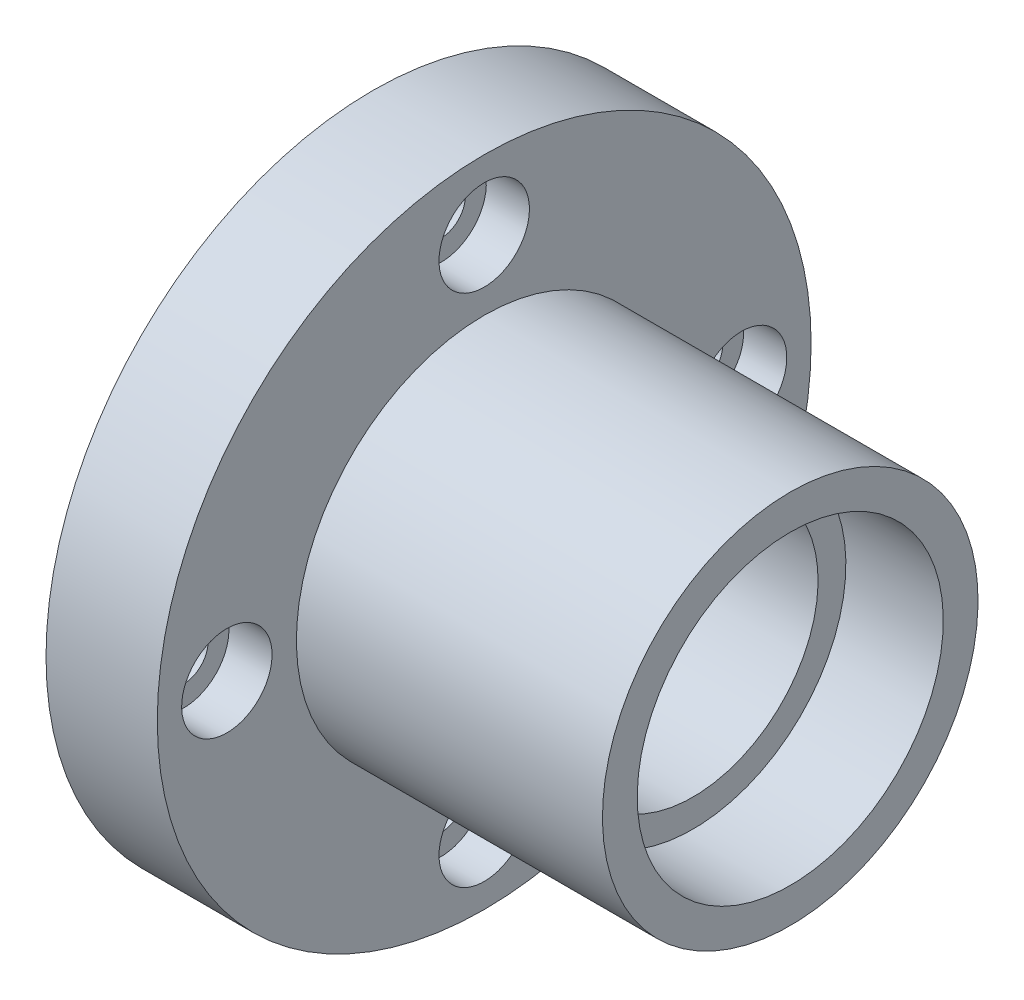
ISO-10303-21;
HEADER;
FILE_DESCRIPTION(('STEP AP214'),'2;1');
FILE_NAME('part.step','',(''),(''),'','','');
FILE_SCHEMA(('AUTOMOTIVE_DESIGN { 1 0 10303 214 1 1 1 1 }'));
ENDSEC;
DATA;
#1=APPLICATION_CONTEXT('core data for automotive mechanical design processes');
#2=APPLICATION_PROTOCOL_DEFINITION('international standard','automotive_design',2000,#1);
#3=PRODUCT_CONTEXT('',#1,'mechanical');
#4=PRODUCT('Part','Part','',(#3));
#5=PRODUCT_RELATED_PRODUCT_CATEGORY('part','',(#4));
#6=PRODUCT_DEFINITION_FORMATION('','',#4);
#7=PRODUCT_DEFINITION_CONTEXT('part definition',#1,'design');
#8=PRODUCT_DEFINITION('design','',#6,#7);
#9=PRODUCT_DEFINITION_SHAPE('','',#8);
#10=(LENGTH_UNIT() NAMED_UNIT(*) SI_UNIT(.MILLI.,.METRE.));
#11=(NAMED_UNIT(*) PLANE_ANGLE_UNIT() SI_UNIT($,.RADIAN.));
#12=(NAMED_UNIT(*) SI_UNIT($,.STERADIAN.) SOLID_ANGLE_UNIT());
#13=UNCERTAINTY_MEASURE_WITH_UNIT(LENGTH_MEASURE(1.E-05),#10,'distance_accuracy_value','');
#14=(GEOMETRIC_REPRESENTATION_CONTEXT(3) GLOBAL_UNCERTAINTY_ASSIGNED_CONTEXT((#13)) GLOBAL_UNIT_ASSIGNED_CONTEXT((#10,
#11,#12)) REPRESENTATION_CONTEXT('',''));
#15=CARTESIAN_POINT('',(0.,0.,0.));
#16=DIRECTION('',(0.,0.,1.));
#17=DIRECTION('',(1.,0.,0.));
#18=AXIS2_PLACEMENT_3D('',#15,#16,#17);
#19=CARTESIAN_POINT('',(0.,0.,0.));
#20=DIRECTION('',(1.,0.,0.));
#21=DIRECTION('',(0.,1.,0.));
#22=AXIS2_PLACEMENT_3D('',#19,#20,#21);
#23=CYLINDRICAL_SURFACE('',#22,13.5);
#24=CARTESIAN_POINT('',(-17.5,0.,0.));
#25=DIRECTION('',(1.,0.,0.));
#26=DIRECTION('',(0.,1.,0.));
#27=AXIS2_PLACEMENT_3D('',#24,#25,#26);
#28=CIRCLE('',#27,13.5);
#29=CARTESIAN_POINT('',(-17.5,13.5,0.));
#30=VERTEX_POINT('',#29);
#31=EDGE_CURVE('E10',#30,#30,#28,.T.);
#32=ORIENTED_EDGE('',*,*,#31,.T.);
#33=EDGE_LOOP('',(#32));
#34=FACE_BOUND('',#33,.T.);
#35=CARTESIAN_POINT('',(-12.5,0.,0.));
#36=DIRECTION('',(1.,0.,0.));
#37=DIRECTION('',(0.,1.,0.));
#38=AXIS2_PLACEMENT_3D('',#35,#36,#37);
#39=CIRCLE('',#38,13.5);
#40=CARTESIAN_POINT('',(-12.5,13.5,0.));
#41=VERTEX_POINT('',#40);
#42=EDGE_CURVE('E135',#41,#41,#39,.T.);
#43=ORIENTED_EDGE('',*,*,#42,.F.);
#44=EDGE_LOOP('',(#43));
#45=FACE_BOUND('',#44,.T.);
#46=ADVANCED_FACE('F49',(#34,#45),#23,.T.);
#47=CARTESIAN_POINT('',(-17.5,13.5,0.));
#48=DIRECTION('',(-1.,0.,0.));
#49=DIRECTION('',(0.,-1.,0.));
#50=AXIS2_PLACEMENT_3D('',#47,#48,#49);
#51=PLANE('',#50);
#52=CARTESIAN_POINT('',(-17.5,0.,0.));
#53=DIRECTION('',(1.,0.,0.));
#54=DIRECTION('',(0.,1.,0.));
#55=AXIS2_PLACEMENT_3D('',#52,#53,#54);
#56=CIRCLE('',#55,11.);
#57=CARTESIAN_POINT('',(-17.5,11.,0.));
#58=VERTEX_POINT('',#57);
#59=EDGE_CURVE('E57',#58,#58,#56,.T.);
#60=ORIENTED_EDGE('',*,*,#59,.T.);
#61=EDGE_LOOP('',(#60));
#62=FACE_BOUND('',#61,.T.);
#63=ORIENTED_EDGE('',*,*,#31,.F.);
#64=EDGE_LOOP('',(#63));
#65=FACE_BOUND('',#64,.T.);
#66=ADVANCED_FACE('F194',(#62,#65),#51,.T.);
#67=CARTESIAN_POINT('',(0.,0.,0.));
#68=DIRECTION('',(1.,0.,0.));
#69=DIRECTION('',(0.,1.,0.));
#70=AXIS2_PLACEMENT_3D('',#67,#68,#69);
#71=CYLINDRICAL_SURFACE('',#70,11.);
#72=CARTESIAN_POINT('',(-10.5,0.,0.));
#73=DIRECTION('',(1.,0.,0.));
#74=DIRECTION('',(0.,1.,0.));
#75=AXIS2_PLACEMENT_3D('',#72,#73,#74);
#76=CIRCLE('',#75,11.);
#77=CARTESIAN_POINT('',(-10.5,11.,0.));
#78=VERTEX_POINT('',#77);
#79=EDGE_CURVE('E65',#78,#78,#76,.T.);
#80=ORIENTED_EDGE('',*,*,#79,.T.);
#81=EDGE_LOOP('',(#80));
#82=FACE_BOUND('',#81,.T.);
#83=ORIENTED_EDGE('',*,*,#59,.F.);
#84=EDGE_LOOP('',(#83));
#85=FACE_BOUND('',#84,.T.);
#86=ADVANCED_FACE('F179',(#82,#85),#71,.F.);
#87=CARTESIAN_POINT('',(-10.5,11.,0.));
#88=DIRECTION('',(-1.,0.,0.));
#89=DIRECTION('',(0.,-1.,0.));
#90=AXIS2_PLACEMENT_3D('',#87,#88,#89);
#91=PLANE('',#90);
#92=CARTESIAN_POINT('',(-10.5,0.,0.));
#93=DIRECTION('',(1.,0.,0.));
#94=DIRECTION('',(0.,1.,0.));
#95=AXIS2_PLACEMENT_3D('',#92,#93,#94);
#96=CIRCLE('',#95,9.);
#97=CARTESIAN_POINT('',(-10.5,9.,0.));
#98=VERTEX_POINT('',#97);
#99=EDGE_CURVE('E170',#98,#98,#96,.T.);
#100=ORIENTED_EDGE('',*,*,#99,.T.);
#101=EDGE_LOOP('',(#100));
#102=FACE_BOUND('',#101,.T.);
#103=ORIENTED_EDGE('',*,*,#79,.F.);
#104=EDGE_LOOP('',(#103));
#105=FACE_BOUND('',#104,.T.);
#106=ADVANCED_FACE('F182',(#102,#105),#91,.T.);
#107=CARTESIAN_POINT('',(0.,0.,0.));
#108=DIRECTION('',(1.,0.,0.));
#109=DIRECTION('',(0.,1.,0.));
#110=AXIS2_PLACEMENT_3D('',#107,#108,#109);
#111=CYLINDRICAL_SURFACE('',#110,9.);
#112=CARTESIAN_POINT('',(10.5,0.,0.));
#113=DIRECTION('',(1.,0.,0.));
#114=DIRECTION('',(0.,1.,0.));
#115=AXIS2_PLACEMENT_3D('',#112,#113,#114);
#116=CIRCLE('',#115,9.);
#117=CARTESIAN_POINT('',(10.5,9.,0.));
#118=VERTEX_POINT('',#117);
#119=EDGE_CURVE('E166',#118,#118,#116,.T.);
#120=ORIENTED_EDGE('',*,*,#119,.T.);
#121=EDGE_LOOP('',(#120));
#122=FACE_BOUND('',#121,.T.);
#123=ORIENTED_EDGE('',*,*,#99,.F.);
#124=EDGE_LOOP('',(#123));
#125=FACE_BOUND('',#124,.T.);
#126=ADVANCED_FACE('F184',(#122,#125),#111,.F.);
#127=CARTESIAN_POINT('',(10.5,9.,0.));
#128=DIRECTION('',(1.,0.,0.));
#129=DIRECTION('',(0.,1.,0.));
#130=AXIS2_PLACEMENT_3D('',#127,#128,#129);
#131=PLANE('',#130);
#132=CARTESIAN_POINT('',(10.5,0.,0.));
#133=DIRECTION('',(1.,0.,0.));
#134=DIRECTION('',(0.,1.,0.));
#135=AXIS2_PLACEMENT_3D('',#132,#133,#134);
#136=CIRCLE('',#135,11.);
#137=CARTESIAN_POINT('',(10.5,11.,0.));
#138=VERTEX_POINT('',#137);
#139=EDGE_CURVE('E162',#138,#138,#136,.T.);
#140=ORIENTED_EDGE('',*,*,#139,.T.);
#141=EDGE_LOOP('',(#140));
#142=FACE_BOUND('',#141,.T.);
#143=ORIENTED_EDGE('',*,*,#119,.F.);
#144=EDGE_LOOP('',(#143));
#145=FACE_BOUND('',#144,.T.);
#146=ADVANCED_FACE('F191',(#142,#145),#131,.T.);
#147=CARTESIAN_POINT('',(0.,0.,0.));
#148=DIRECTION('',(1.,0.,0.));
#149=DIRECTION('',(0.,1.,0.));
#150=AXIS2_PLACEMENT_3D('',#147,#148,#149);
#151=CYLINDRICAL_SURFACE('',#150,11.);
#152=CARTESIAN_POINT('',(17.5,0.,0.));
#153=DIRECTION('',(1.,0.,0.));
#154=DIRECTION('',(0.,1.,0.));
#155=AXIS2_PLACEMENT_3D('',#152,#153,#154);
#156=CIRCLE('',#155,11.);
#157=CARTESIAN_POINT('',(17.5,11.,0.));
#158=VERTEX_POINT('',#157);
#159=EDGE_CURVE('E158',#158,#158,#156,.T.);
#160=ORIENTED_EDGE('',*,*,#159,.T.);
#161=EDGE_LOOP('',(#160));
#162=FACE_BOUND('',#161,.T.);
#163=ORIENTED_EDGE('',*,*,#139,.F.);
#164=EDGE_LOOP('',(#163));
#165=FACE_BOUND('',#164,.T.);
#166=ADVANCED_FACE('F234',(#162,#165),#151,.F.);
#167=CARTESIAN_POINT('',(17.5,13.5,0.));
#168=DIRECTION('',(1.,0.,0.));
#169=DIRECTION('',(0.,1.,0.));
#170=AXIS2_PLACEMENT_3D('',#167,#168,#169);
#171=PLANE('',#170);
#172=CARTESIAN_POINT('',(17.5,0.,0.));
#173=DIRECTION('',(1.,0.,0.));
#174=DIRECTION('',(0.,1.,0.));
#175=AXIS2_PLACEMENT_3D('',#172,#173,#174);
#176=CIRCLE('',#175,13.5);
#177=CARTESIAN_POINT('',(17.5,13.5,0.));
#178=VERTEX_POINT('',#177);
#179=EDGE_CURVE('E154',#178,#178,#176,.T.);
#180=ORIENTED_EDGE('',*,*,#179,.T.);
#181=EDGE_LOOP('',(#180));
#182=FACE_BOUND('',#181,.T.);
#183=ORIENTED_EDGE('',*,*,#159,.F.);
#184=EDGE_LOOP('',(#183));
#185=FACE_BOUND('',#184,.T.);
#186=ADVANCED_FACE('F228',(#182,#185),#171,.T.);
#187=CARTESIAN_POINT('',(0.,0.,0.));
#188=DIRECTION('',(1.,0.,0.));
#189=DIRECTION('',(0.,1.,0.));
#190=AXIS2_PLACEMENT_3D('',#187,#188,#189);
#191=CYLINDRICAL_SURFACE('',#190,13.5);
#192=CARTESIAN_POINT('',(-4.49999999999999,0.,0.));
#193=DIRECTION('',(1.,0.,0.));
#194=DIRECTION('',(0.,1.,0.));
#195=AXIS2_PLACEMENT_3D('',#192,#193,#194);
#196=CIRCLE('',#195,13.5);
#197=CARTESIAN_POINT('',(-4.49999999999999,13.5,0.));
#198=VERTEX_POINT('',#197);
#199=EDGE_CURVE('E150',#198,#198,#196,.T.);
#200=ORIENTED_EDGE('',*,*,#199,.T.);
#201=EDGE_LOOP('',(#200));
#202=FACE_BOUND('',#201,.T.);
#203=ORIENTED_EDGE('',*,*,#179,.F.);
#204=EDGE_LOOP('',(#203));
#205=FACE_BOUND('',#204,.T.);
#206=ADVANCED_FACE('F221',(#202,#205),#191,.T.);
#207=CARTESIAN_POINT('',(-4.49999999999999,23.5,0.));
#208=DIRECTION('',(1.,0.,0.));
#209=DIRECTION('',(0.,1.,0.));
#210=AXIS2_PLACEMENT_3D('',#207,#208,#209);
#211=PLANE('',#210);
#212=CARTESIAN_POINT('',(-4.49999999999999,0.,18.5));
#213=DIRECTION('',(1.,0.,0.));
#214=DIRECTION('',(0.,1.,0.));
#215=AXIS2_PLACEMENT_3D('',#212,#213,#214);
#216=CIRCLE('',#215,3.25);
#217=CARTESIAN_POINT('',(-4.49999999999999,3.25,18.5));
#218=VERTEX_POINT('',#217);
#219=EDGE_CURVE('E106',#218,#218,#216,.T.);
#220=ORIENTED_EDGE('',*,*,#219,.F.);
#221=EDGE_LOOP('',(#220));
#222=FACE_BOUND('',#221,.T.);
#223=CARTESIAN_POINT('',(-4.49999999999999,0.,-18.5));
#224=DIRECTION('',(1.,0.,0.));
#225=DIRECTION('',(0.,1.,0.));
#226=AXIS2_PLACEMENT_3D('',#223,#224,#225);
#227=CIRCLE('',#226,3.25);
#228=CARTESIAN_POINT('',(-4.49999999999999,3.25,-18.5));
#229=VERTEX_POINT('',#228);
#230=EDGE_CURVE('E111',#229,#229,#227,.T.);
#231=ORIENTED_EDGE('',*,*,#230,.F.);
#232=EDGE_LOOP('',(#231));
#233=FACE_BOUND('',#232,.T.);
#234=CARTESIAN_POINT('',(-4.49999999999998,-18.5,0.));
#235=DIRECTION('',(1.,0.,0.));
#236=DIRECTION('',(0.,-1.,0.));
#237=AXIS2_PLACEMENT_3D('',#234,#235,#236);
#238=CIRCLE('',#237,3.25);
#239=CARTESIAN_POINT('',(-4.49999999999998,-15.25,0.));
#240=VERTEX_POINT('',#239);
#241=EDGE_CURVE('E119',#240,#240,#238,.T.);
#242=ORIENTED_EDGE('',*,*,#241,.F.);
#243=EDGE_LOOP('',(#242));
#244=FACE_BOUND('',#243,.T.);
#245=CARTESIAN_POINT('',(-4.49999999999999,18.5,0.));
#246=DIRECTION('',(1.,0.,0.));
#247=DIRECTION('',(0.,1.,0.));
#248=AXIS2_PLACEMENT_3D('',#245,#246,#247);
#249=CIRCLE('',#248,3.25);
#250=CARTESIAN_POINT('',(-4.49999999999999,21.75,0.));
#251=VERTEX_POINT('',#250);
#252=EDGE_CURVE('E127',#251,#251,#249,.T.);
#253=ORIENTED_EDGE('',*,*,#252,.F.);
#254=EDGE_LOOP('',(#253));
#255=FACE_BOUND('',#254,.T.);
#256=CARTESIAN_POINT('',(-4.49999999999998,0.,0.));
#257=DIRECTION('',(1.,0.,0.));
#258=DIRECTION('',(0.,1.,0.));
#259=AXIS2_PLACEMENT_3D('',#256,#257,#258);
#260=CIRCLE('',#259,23.5);
#261=CARTESIAN_POINT('',(-4.49999999999999,23.5,0.));
#262=VERTEX_POINT('',#261);
#263=EDGE_CURVE('E146',#262,#262,#260,.T.);
#264=ORIENTED_EDGE('',*,*,#263,.T.);
#265=EDGE_LOOP('',(#264));
#266=FACE_BOUND('',#265,.T.);
#267=ORIENTED_EDGE('',*,*,#199,.F.);
#268=EDGE_LOOP('',(#267));
#269=FACE_BOUND('',#268,.T.);
#270=ADVANCED_FACE('F215',(#222,#233,#244,#255,#266,#269),#211,.T.);
#271=CARTESIAN_POINT('',(0.,0.,0.));
#272=DIRECTION('',(1.,0.,0.));
#273=DIRECTION('',(0.,1.,0.));
#274=AXIS2_PLACEMENT_3D('',#271,#272,#273);
#275=CYLINDRICAL_SURFACE('',#274,23.5);
#276=CARTESIAN_POINT('',(-12.5,0.,0.));
#277=DIRECTION('',(1.,0.,0.));
#278=DIRECTION('',(0.,1.,0.));
#279=AXIS2_PLACEMENT_3D('',#276,#277,#278);
#280=CIRCLE('',#279,23.5);
#281=CARTESIAN_POINT('',(-12.5,23.5,0.));
#282=VERTEX_POINT('',#281);
#283=EDGE_CURVE('E142',#282,#282,#280,.T.);
#284=ORIENTED_EDGE('',*,*,#283,.T.);
#285=EDGE_LOOP('',(#284));
#286=FACE_BOUND('',#285,.T.);
#287=ORIENTED_EDGE('',*,*,#263,.F.);
#288=EDGE_LOOP('',(#287));
#289=FACE_BOUND('',#288,.T.);
#290=ADVANCED_FACE('F208',(#286,#289),#275,.T.);
#291=CARTESIAN_POINT('',(-12.5,13.5,0.));
#292=DIRECTION('',(-1.,0.,0.));
#293=DIRECTION('',(0.,-1.,0.));
#294=AXIS2_PLACEMENT_3D('',#291,#292,#293);
#295=PLANE('',#294);
#296=CARTESIAN_POINT('',(-12.5,0.,18.5));
#297=DIRECTION('',(-1.,0.,0.));
#298=DIRECTION('',(0.,-1.,0.));
#299=AXIS2_PLACEMENT_3D('',#296,#297,#298);
#300=CIRCLE('',#299,1.75);
#301=CARTESIAN_POINT('',(-12.5,-1.75,18.5));
#302=VERTEX_POINT('',#301);
#303=EDGE_CURVE('E82',#302,#302,#300,.T.);
#304=ORIENTED_EDGE('',*,*,#303,.F.);
#305=EDGE_LOOP('',(#304));
#306=FACE_BOUND('',#305,.T.);
#307=CARTESIAN_POINT('',(-12.5,-18.5,0.));
#308=DIRECTION('',(-1.,0.,0.));
#309=DIRECTION('',(0.,-1.,0.));
#310=AXIS2_PLACEMENT_3D('',#307,#308,#309);
#311=CIRCLE('',#310,1.75);
#312=CARTESIAN_POINT('',(-12.5,-20.25,0.));
#313=VERTEX_POINT('',#312);
#314=EDGE_CURVE('E78',#313,#313,#311,.T.);
#315=ORIENTED_EDGE('',*,*,#314,.F.);
#316=EDGE_LOOP('',(#315));
#317=FACE_BOUND('',#316,.T.);
#318=CARTESIAN_POINT('',(-12.5,0.,-18.5));
#319=DIRECTION('',(-1.,0.,0.));
#320=DIRECTION('',(0.,-1.,0.));
#321=AXIS2_PLACEMENT_3D('',#318,#319,#320);
#322=CIRCLE('',#321,1.75);
#323=CARTESIAN_POINT('',(-12.5,-1.75,-18.5));
#324=VERTEX_POINT('',#323);
#325=EDGE_CURVE('E74',#324,#324,#322,.T.);
#326=ORIENTED_EDGE('',*,*,#325,.F.);
#327=EDGE_LOOP('',(#326));
#328=FACE_BOUND('',#327,.T.);
#329=CARTESIAN_POINT('',(-12.5,18.5,0.));
#330=DIRECTION('',(-1.,0.,0.));
#331=DIRECTION('',(0.,-1.,0.));
#332=AXIS2_PLACEMENT_3D('',#329,#330,#331);
#333=CIRCLE('',#332,1.75);
#334=CARTESIAN_POINT('',(-12.5,16.75,0.));
#335=VERTEX_POINT('',#334);
#336=EDGE_CURVE('E73',#335,#335,#333,.T.);
#337=ORIENTED_EDGE('',*,*,#336,.F.);
#338=EDGE_LOOP('',(#337));
#339=FACE_BOUND('',#338,.T.);
#340=ORIENTED_EDGE('',*,*,#42,.T.);
#341=EDGE_LOOP('',(#340));
#342=FACE_BOUND('',#341,.T.);
#343=ORIENTED_EDGE('',*,*,#283,.F.);
#344=EDGE_LOOP('',(#343));
#345=FACE_BOUND('',#344,.T.);
#346=ADVANCED_FACE('F204',(#306,#317,#328,#339,#342,#345),#295,.T.);
#347=CARTESIAN_POINT('',(-7.59999999999999,18.5,0.));
#348=DIRECTION('',(1.,0.,0.));
#349=DIRECTION('',(0.,1.,0.));
#350=AXIS2_PLACEMENT_3D('',#347,#348,#349);
#351=CYLINDRICAL_SURFACE('',#350,3.25);
#352=CARTESIAN_POINT('',(-7.59999999999999,18.5,0.));
#353=DIRECTION('',(1.,0.,0.));
#354=DIRECTION('',(0.,1.,0.));
#355=AXIS2_PLACEMENT_3D('',#352,#353,#354);
#356=CIRCLE('',#355,3.25);
#357=CARTESIAN_POINT('',(-7.59999999999999,21.75,0.));
#358=VERTEX_POINT('',#357);
#359=EDGE_CURVE('E131',#358,#358,#356,.T.);
#360=CARTESIAN_POINT('',(-7.59999999999999,21.75,0.));
#361=CARTESIAN_POINT('',(-7.56770833333332,21.75,0.));
#362=CARTESIAN_POINT('',(-7.53541666666666,21.75,0.));
#363=CARTESIAN_POINT('',(-7.47083333333332,21.75,0.));
#364=CARTESIAN_POINT('',(-7.43854166666666,21.75,0.));
#365=CARTESIAN_POINT('',(-7.37395833333332,21.75,0.));
#366=CARTESIAN_POINT('',(-7.34166666666666,21.75,0.));
#367=CARTESIAN_POINT('',(-7.27708333333332,21.75,0.));
#368=CARTESIAN_POINT('',(-7.24479166666666,21.75,0.));
#369=CARTESIAN_POINT('',(-7.18020833333332,21.75,0.));
#370=CARTESIAN_POINT('',(-7.14791666666666,21.75,0.));
#371=CARTESIAN_POINT('',(-7.08333333333332,21.75,0.));
#372=CARTESIAN_POINT('',(-7.05104166666666,21.75,0.));
#373=CARTESIAN_POINT('',(-6.98645833333332,21.75,0.));
#374=CARTESIAN_POINT('',(-6.95416666666666,21.75,0.));
#375=CARTESIAN_POINT('',(-6.88958333333332,21.75,0.));
#376=CARTESIAN_POINT('',(-6.85729166666666,21.75,0.));
#377=CARTESIAN_POINT('',(-6.79270833333332,21.75,0.));
#378=CARTESIAN_POINT('',(-6.76041666666666,21.75,0.));
#379=CARTESIAN_POINT('',(-6.69583333333332,21.75,0.));
#380=CARTESIAN_POINT('',(-6.66354166666666,21.75,0.));
#381=CARTESIAN_POINT('',(-6.59895833333332,21.75,0.));
#382=CARTESIAN_POINT('',(-6.56666666666666,21.75,0.));
#383=CARTESIAN_POINT('',(-6.50208333333332,21.75,0.));
#384=CARTESIAN_POINT('',(-6.46979166666666,21.75,0.));
#385=CARTESIAN_POINT('',(-6.40520833333332,21.75,0.));
#386=CARTESIAN_POINT('',(-6.37291666666666,21.75,0.));
#387=CARTESIAN_POINT('',(-6.30833333333332,21.75,0.));
#388=CARTESIAN_POINT('',(-6.27604166666666,21.75,0.));
#389=CARTESIAN_POINT('',(-6.21145833333332,21.75,0.));
#390=CARTESIAN_POINT('',(-6.17916666666666,21.75,0.));
#391=CARTESIAN_POINT('',(-6.11458333333332,21.75,0.));
#392=CARTESIAN_POINT('',(-6.08229166666666,21.75,0.));
#393=CARTESIAN_POINT('',(-6.01770833333332,21.75,0.));
#394=CARTESIAN_POINT('',(-5.98541666666666,21.75,0.));
#395=CARTESIAN_POINT('',(-5.92083333333332,21.75,0.));
#396=CARTESIAN_POINT('',(-5.88854166666666,21.75,0.));
#397=CARTESIAN_POINT('',(-5.82395833333332,21.75,0.));
#398=CARTESIAN_POINT('',(-5.79166666666666,21.75,0.));
#399=CARTESIAN_POINT('',(-5.72708333333332,21.75,0.));
#400=CARTESIAN_POINT('',(-5.69479166666666,21.75,0.));
#401=CARTESIAN_POINT('',(-5.63020833333332,21.75,0.));
#402=CARTESIAN_POINT('',(-5.59791666666666,21.75,0.));
#403=CARTESIAN_POINT('',(-5.53333333333332,21.75,0.));
#404=CARTESIAN_POINT('',(-5.50104166666666,21.75,0.));
#405=CARTESIAN_POINT('',(-5.43645833333332,21.75,0.));
#406=CARTESIAN_POINT('',(-5.40416666666666,21.75,0.));
#407=CARTESIAN_POINT('',(-5.33958333333332,21.75,0.));
#408=CARTESIAN_POINT('',(-5.30729166666666,21.75,0.));
#409=CARTESIAN_POINT('',(-5.24270833333332,21.75,0.));
#410=CARTESIAN_POINT('',(-5.21041666666666,21.75,0.));
#411=CARTESIAN_POINT('',(-5.14583333333332,21.75,0.));
#412=CARTESIAN_POINT('',(-5.11354166666665,21.75,0.));
#413=CARTESIAN_POINT('',(-5.04895833333332,21.75,0.));
#414=CARTESIAN_POINT('',(-5.01666666666666,21.75,0.));
#415=CARTESIAN_POINT('',(-4.95208333333332,21.75,0.));
#416=CARTESIAN_POINT('',(-4.91979166666666,21.75,0.));
#417=CARTESIAN_POINT('',(-4.85520833333332,21.75,0.));
#418=CARTESIAN_POINT('',(-4.82291666666666,21.75,0.));
#419=CARTESIAN_POINT('',(-4.75833333333332,21.75,0.));
#420=CARTESIAN_POINT('',(-4.72604166666666,21.75,0.));
#421=CARTESIAN_POINT('',(-4.66145833333332,21.75,0.));
#422=CARTESIAN_POINT('',(-4.62916666666666,21.75,0.));
#423=CARTESIAN_POINT('',(-4.56458333333332,21.75,0.));
#424=CARTESIAN_POINT('',(-4.53229166666666,21.75,0.));
#425=CARTESIAN_POINT('',(-4.49999999999999,21.75,0.));
#426=B_SPLINE_CURVE_WITH_KNOTS('',3,(#360,#361,#362,#363,#364,#365,#366,#367,#368,#369,#370,
#371,#372,#373,#374,#375,#376,#377,#378,#379,#380,#381,#382,#383,#384,#385,#386,#387,#388,#389,
#390,#391,#392,#393,#394,#395,#396,#397,#398,#399,#400,#401,#402,#403,#404,#405,#406,#407,#408,
#409,#410,#411,#412,#413,#414,#415,#416,#417,#418,#419,#420,#421,#422,#423,#424,#425),
.UNSPECIFIED.,.F.,.F.,(4,2,2,2,2,2,2,2,2,2,2,2,2,2,2,2,2,2,2,2,2,2,2,2,2,2,2,2,2,2,2,2,4),(0.,
0.0968750000000006,0.19375,0.290625,0.387500000000001,0.484375,0.58125,0.678125000000001,0.775,
0.871875,0.968750000000001,1.065625,1.1625,1.259375,1.35625,1.453125,1.55,1.646875,1.74375,
1.840625,1.9375,2.034375,2.13125,2.228125,2.325,2.421875,2.51875,2.615625,2.7125,2.809375,
2.90625,3.003125,3.1),.UNSPECIFIED.);
#427=EDGE_CURVE('BSEAM207',#358,#251,#426,.T.);
#428=ORIENTED_EDGE('',*,*,#359,.F.);
#429=ORIENTED_EDGE('',*,*,#252,.T.);
#430=ORIENTED_EDGE('',*,*,#427,.T.);
#431=ORIENTED_EDGE('',*,*,#427,.F.);
#432=EDGE_LOOP('',(#428,#430,#429,#431));
#433=FACE_BOUND('',#432,.T.);
#434=ADVANCED_FACE('F207',(#433),#351,.F.);
#435=CARTESIAN_POINT('',(-7.59999999999999,18.5,0.));
#436=DIRECTION('',(1.,0.,0.));
#437=DIRECTION('',(0.,1.,0.));
#438=AXIS2_PLACEMENT_3D('',#435,#436,#437);
#439=PLANE('',#438);
#440=CARTESIAN_POINT('',(-7.59999999999999,18.5,0.));
#441=DIRECTION('',(1.,0.,0.));
#442=DIRECTION('',(0.,1.,0.));
#443=AXIS2_PLACEMENT_3D('',#440,#441,#442);
#444=CIRCLE('',#443,1.75);
#445=CARTESIAN_POINT('',(-7.59999999999999,20.25,0.));
#446=VERTEX_POINT('',#445);
#447=EDGE_CURVE('E69',#446,#446,#444,.T.);
#448=ORIENTED_EDGE('',*,*,#447,.F.);
#449=EDGE_LOOP('',(#448));
#450=FACE_BOUND('',#449,.T.);
#451=ORIENTED_EDGE('',*,*,#359,.T.);
#452=EDGE_LOOP('',(#451));
#453=FACE_BOUND('',#452,.T.);
#454=ADVANCED_FACE('F254',(#450,#453),#439,.T.);
#455=CARTESIAN_POINT('',(-7.59999999999998,-18.5,0.));
#456=DIRECTION('',(1.,0.,0.));
#457=DIRECTION('',(0.,1.,0.));
#458=AXIS2_PLACEMENT_3D('',#455,#456,#457);
#459=CYLINDRICAL_SURFACE('',#458,3.25);
#460=CARTESIAN_POINT('',(-7.59999999999998,-18.5,0.));
#461=DIRECTION('',(1.,0.,0.));
#462=DIRECTION('',(0.,-1.,0.));
#463=AXIS2_PLACEMENT_3D('',#460,#461,#462);
#464=CIRCLE('',#463,3.25);
#465=CARTESIAN_POINT('',(-7.59999999999998,-15.25,0.));
#466=VERTEX_POINT('',#465);
#467=EDGE_CURVE('E123',#466,#466,#464,.T.);
#468=CARTESIAN_POINT('',(-7.59999999999998,-15.25,0.));
#469=CARTESIAN_POINT('',(-7.56770833333332,-15.25,0.));
#470=CARTESIAN_POINT('',(-7.53541666666665,-15.25,0.));
#471=CARTESIAN_POINT('',(-7.47083333333332,-15.25,0.));
#472=CARTESIAN_POINT('',(-7.43854166666665,-15.25,0.));
#473=CARTESIAN_POINT('',(-7.37395833333332,-15.25,0.));
#474=CARTESIAN_POINT('',(-7.34166666666665,-15.25,0.));
#475=CARTESIAN_POINT('',(-7.27708333333332,-15.25,0.));
#476=CARTESIAN_POINT('',(-7.24479166666665,-15.25,0.));
#477=CARTESIAN_POINT('',(-7.18020833333332,-15.25,0.));
#478=CARTESIAN_POINT('',(-7.14791666666665,-15.25,0.));
#479=CARTESIAN_POINT('',(-7.08333333333332,-15.25,0.));
#480=CARTESIAN_POINT('',(-7.05104166666665,-15.25,0.));
#481=CARTESIAN_POINT('',(-6.98645833333332,-15.25,0.));
#482=CARTESIAN_POINT('',(-6.95416666666665,-15.25,0.));
#483=CARTESIAN_POINT('',(-6.88958333333332,-15.25,0.));
#484=CARTESIAN_POINT('',(-6.85729166666665,-15.25,0.));
#485=CARTESIAN_POINT('',(-6.79270833333332,-15.25,0.));
#486=CARTESIAN_POINT('',(-6.76041666666665,-15.25,0.));
#487=CARTESIAN_POINT('',(-6.69583333333332,-15.25,0.));
#488=CARTESIAN_POINT('',(-6.66354166666665,-15.25,0.));
#489=CARTESIAN_POINT('',(-6.59895833333332,-15.25,0.));
#490=CARTESIAN_POINT('',(-6.56666666666665,-15.25,0.));
#491=CARTESIAN_POINT('',(-6.50208333333332,-15.25,0.));
#492=CARTESIAN_POINT('',(-6.46979166666665,-15.25,0.));
#493=CARTESIAN_POINT('',(-6.40520833333332,-15.25,0.));
#494=CARTESIAN_POINT('',(-6.37291666666665,-15.25,0.));
#495=CARTESIAN_POINT('',(-6.30833333333332,-15.25,0.));
#496=CARTESIAN_POINT('',(-6.27604166666665,-15.25,0.));
#497=CARTESIAN_POINT('',(-6.21145833333332,-15.25,0.));
#498=CARTESIAN_POINT('',(-6.17916666666665,-15.25,0.));
#499=CARTESIAN_POINT('',(-6.11458333333332,-15.25,0.));
#500=CARTESIAN_POINT('',(-6.08229166666665,-15.25,0.));
#501=CARTESIAN_POINT('',(-6.01770833333332,-15.25,0.));
#502=CARTESIAN_POINT('',(-5.98541666666665,-15.25,0.));
#503=CARTESIAN_POINT('',(-5.92083333333332,-15.25,0.));
#504=CARTESIAN_POINT('',(-5.88854166666665,-15.25,0.));
#505=CARTESIAN_POINT('',(-5.82395833333332,-15.25,0.));
#506=CARTESIAN_POINT('',(-5.79166666666665,-15.25,0.));
#507=CARTESIAN_POINT('',(-5.72708333333332,-15.25,0.));
#508=CARTESIAN_POINT('',(-5.69479166666665,-15.25,0.));
#509=CARTESIAN_POINT('',(-5.63020833333332,-15.25,0.));
#510=CARTESIAN_POINT('',(-5.59791666666665,-15.25,0.));
#511=CARTESIAN_POINT('',(-5.53333333333332,-15.25,0.));
#512=CARTESIAN_POINT('',(-5.50104166666665,-15.25,0.));
#513=CARTESIAN_POINT('',(-5.43645833333332,-15.25,0.));
#514=CARTESIAN_POINT('',(-5.40416666666665,-15.25,0.));
#515=CARTESIAN_POINT('',(-5.33958333333332,-15.25,0.));
#516=CARTESIAN_POINT('',(-5.30729166666665,-15.25,0.));
#517=CARTESIAN_POINT('',(-5.24270833333332,-15.25,0.));
#518=CARTESIAN_POINT('',(-5.21041666666665,-15.25,0.));
#519=CARTESIAN_POINT('',(-5.14583333333332,-15.25,0.));
#520=CARTESIAN_POINT('',(-5.11354166666665,-15.25,0.));
#521=CARTESIAN_POINT('',(-5.04895833333332,-15.25,0.));
#522=CARTESIAN_POINT('',(-5.01666666666665,-15.25,0.));
#523=CARTESIAN_POINT('',(-4.95208333333332,-15.25,0.));
#524=CARTESIAN_POINT('',(-4.91979166666665,-15.25,0.));
#525=CARTESIAN_POINT('',(-4.85520833333332,-15.25,0.));
#526=CARTESIAN_POINT('',(-4.82291666666665,-15.25,0.));
#527=CARTESIAN_POINT('',(-4.75833333333332,-15.25,0.));
#528=CARTESIAN_POINT('',(-4.72604166666665,-15.25,0.));
#529=CARTESIAN_POINT('',(-4.66145833333332,-15.25,0.));
#530=CARTESIAN_POINT('',(-4.62916666666665,-15.25,0.));
#531=CARTESIAN_POINT('',(-4.56458333333332,-15.25,0.));
#532=CARTESIAN_POINT('',(-4.53229166666665,-15.25,0.));
#533=CARTESIAN_POINT('',(-4.49999999999998,-15.25,0.));
#534=B_SPLINE_CURVE_WITH_KNOTS('',3,(#468,#469,#470,#471,#472,#473,#474,#475,#476,#477,#478,
#479,#480,#481,#482,#483,#484,#485,#486,#487,#488,#489,#490,#491,#492,#493,#494,#495,#496,#497,
#498,#499,#500,#501,#502,#503,#504,#505,#506,#507,#508,#509,#510,#511,#512,#513,#514,#515,#516,
#517,#518,#519,#520,#521,#522,#523,#524,#525,#526,#527,#528,#529,#530,#531,#532,#533),
.UNSPECIFIED.,.F.,.F.,(4,2,2,2,2,2,2,2,2,2,2,2,2,2,2,2,2,2,2,2,2,2,2,2,2,2,2,2,2,2,2,2,4),(0.,
0.0968750000000006,0.19375,0.290625,0.387500000000001,0.484375,0.58125,0.678125000000001,0.775,
0.871875,0.968750000000001,1.065625,1.1625,1.259375,1.35625,1.453125,1.55,1.646875,1.74375,
1.840625,1.9375,2.034375,2.13125,2.228125,2.325,2.421875,2.51875,2.615625,2.7125,2.809375,
2.90625,3.003125,3.1),.UNSPECIFIED.);
#535=EDGE_CURVE('BSEAM258',#466,#240,#534,.T.);
#536=ORIENTED_EDGE('',*,*,#467,.F.);
#537=ORIENTED_EDGE('',*,*,#241,.T.);
#538=ORIENTED_EDGE('',*,*,#535,.T.);
#539=ORIENTED_EDGE('',*,*,#535,.F.);
#540=EDGE_LOOP('',(#536,#538,#537,#539));
#541=FACE_BOUND('',#540,.T.);
#542=ADVANCED_FACE('F258',(#541),#459,.F.);
#543=CARTESIAN_POINT('',(-7.59999999999998,-18.5,0.));
#544=DIRECTION('',(-1.,0.,0.));
#545=DIRECTION('',(0.,-1.,0.));
#546=AXIS2_PLACEMENT_3D('',#543,#544,#545);
#547=PLANE('',#546);
#548=CARTESIAN_POINT('',(-7.59999999999998,-18.5,0.));
#549=DIRECTION('',(-1.,0.,0.));
#550=DIRECTION('',(0.,-1.,0.));
#551=AXIS2_PLACEMENT_3D('',#548,#549,#550);
#552=CIRCLE('',#551,1.75);
#553=CARTESIAN_POINT('',(-7.59999999999998,-20.25,0.));
#554=VERTEX_POINT('',#553);
#555=EDGE_CURVE('E79',#554,#554,#552,.T.);
#556=ORIENTED_EDGE('',*,*,#555,.T.);
#557=EDGE_LOOP('',(#556));
#558=FACE_BOUND('',#557,.T.);
#559=ORIENTED_EDGE('',*,*,#467,.T.);
#560=EDGE_LOOP('',(#559));
#561=FACE_BOUND('',#560,.T.);
#562=ADVANCED_FACE('F262',(#558,#561),#547,.F.);
#563=CARTESIAN_POINT('',(-7.59999999999999,0.,-18.5));
#564=DIRECTION('',(1.,0.,0.));
#565=DIRECTION('',(0.,1.,0.));
#566=AXIS2_PLACEMENT_3D('',#563,#564,#565);
#567=CYLINDRICAL_SURFACE('',#566,3.25);
#568=CARTESIAN_POINT('',(-7.59999999999999,0.,-18.5));
#569=DIRECTION('',(1.,0.,0.));
#570=DIRECTION('',(0.,1.,0.));
#571=AXIS2_PLACEMENT_3D('',#568,#569,#570);
#572=CIRCLE('',#571,3.25);
#573=CARTESIAN_POINT('',(-7.59999999999999,3.25,-18.5));
#574=VERTEX_POINT('',#573);
#575=EDGE_CURVE('E115',#574,#574,#572,.T.);
#576=CARTESIAN_POINT('',(-7.59999999999999,3.25,-18.5));
#577=CARTESIAN_POINT('',(-7.56770833333332,3.25,-18.5));
#578=CARTESIAN_POINT('',(-7.53541666666665,3.25,-18.5));
#579=CARTESIAN_POINT('',(-7.47083333333332,3.25,-18.5));
#580=CARTESIAN_POINT('',(-7.43854166666665,3.25,-18.5));
#581=CARTESIAN_POINT('',(-7.37395833333332,3.25,-18.5));
#582=CARTESIAN_POINT('',(-7.34166666666665,3.25,-18.5));
#583=CARTESIAN_POINT('',(-7.27708333333332,3.25,-18.5));
#584=CARTESIAN_POINT('',(-7.24479166666665,3.25,-18.5));
#585=CARTESIAN_POINT('',(-7.18020833333332,3.25,-18.5));
#586=CARTESIAN_POINT('',(-7.14791666666665,3.25,-18.5));
#587=CARTESIAN_POINT('',(-7.08333333333332,3.25,-18.5));
#588=CARTESIAN_POINT('',(-7.05104166666665,3.25,-18.5));
#589=CARTESIAN_POINT('',(-6.98645833333332,3.25,-18.5));
#590=CARTESIAN_POINT('',(-6.95416666666665,3.25,-18.5));
#591=CARTESIAN_POINT('',(-6.88958333333332,3.25,-18.5));
#592=CARTESIAN_POINT('',(-6.85729166666665,3.25,-18.5));
#593=CARTESIAN_POINT('',(-6.79270833333332,3.25,-18.5));
#594=CARTESIAN_POINT('',(-6.76041666666665,3.25,-18.5));
#595=CARTESIAN_POINT('',(-6.69583333333332,3.25,-18.5));
#596=CARTESIAN_POINT('',(-6.66354166666665,3.25,-18.5));
#597=CARTESIAN_POINT('',(-6.59895833333332,3.25,-18.5));
#598=CARTESIAN_POINT('',(-6.56666666666665,3.25,-18.5));
#599=CARTESIAN_POINT('',(-6.50208333333332,3.25,-18.5));
#600=CARTESIAN_POINT('',(-6.46979166666665,3.25,-18.5));
#601=CARTESIAN_POINT('',(-6.40520833333332,3.25,-18.5));
#602=CARTESIAN_POINT('',(-6.37291666666665,3.25,-18.5));
#603=CARTESIAN_POINT('',(-6.30833333333332,3.25,-18.5));
#604=CARTESIAN_POINT('',(-6.27604166666665,3.25,-18.5));
#605=CARTESIAN_POINT('',(-6.21145833333332,3.25,-18.5));
#606=CARTESIAN_POINT('',(-6.17916666666665,3.25,-18.5));
#607=CARTESIAN_POINT('',(-6.11458333333332,3.25,-18.5));
#608=CARTESIAN_POINT('',(-6.08229166666665,3.25,-18.5));
#609=CARTESIAN_POINT('',(-6.01770833333332,3.25,-18.5));
#610=CARTESIAN_POINT('',(-5.98541666666665,3.25,-18.5));
#611=CARTESIAN_POINT('',(-5.92083333333332,3.25,-18.5));
#612=CARTESIAN_POINT('',(-5.88854166666665,3.25,-18.5));
#613=CARTESIAN_POINT('',(-5.82395833333332,3.25,-18.5));
#614=CARTESIAN_POINT('',(-5.79166666666665,3.25,-18.5));
#615=CARTESIAN_POINT('',(-5.72708333333332,3.25,-18.5));
#616=CARTESIAN_POINT('',(-5.69479166666665,3.25,-18.5));
#617=CARTESIAN_POINT('',(-5.63020833333332,3.25,-18.5));
#618=CARTESIAN_POINT('',(-5.59791666666665,3.25,-18.5));
#619=CARTESIAN_POINT('',(-5.53333333333332,3.25,-18.5));
#620=CARTESIAN_POINT('',(-5.50104166666665,3.25,-18.5));
#621=CARTESIAN_POINT('',(-5.43645833333332,3.25,-18.5));
#622=CARTESIAN_POINT('',(-5.40416666666665,3.25,-18.5));
#623=CARTESIAN_POINT('',(-5.33958333333332,3.25,-18.5));
#624=CARTESIAN_POINT('',(-5.30729166666665,3.25,-18.5));
#625=CARTESIAN_POINT('',(-5.24270833333332,3.25,-18.5));
#626=CARTESIAN_POINT('',(-5.21041666666665,3.25,-18.5));
#627=CARTESIAN_POINT('',(-5.14583333333332,3.25,-18.5));
#628=CARTESIAN_POINT('',(-5.11354166666665,3.25,-18.5));
#629=CARTESIAN_POINT('',(-5.04895833333332,3.25,-18.5));
#630=CARTESIAN_POINT('',(-5.01666666666665,3.25,-18.5));
#631=CARTESIAN_POINT('',(-4.95208333333332,3.25,-18.5));
#632=CARTESIAN_POINT('',(-4.91979166666665,3.25,-18.5));
#633=CARTESIAN_POINT('',(-4.85520833333332,3.25,-18.5));
#634=CARTESIAN_POINT('',(-4.82291666666665,3.25,-18.5));
#635=CARTESIAN_POINT('',(-4.75833333333332,3.25,-18.5));
#636=CARTESIAN_POINT('',(-4.72604166666665,3.25,-18.5));
#637=CARTESIAN_POINT('',(-4.66145833333332,3.25,-18.5));
#638=CARTESIAN_POINT('',(-4.62916666666665,3.25,-18.5));
#639=CARTESIAN_POINT('',(-4.56458333333332,3.25,-18.5));
#640=CARTESIAN_POINT('',(-4.53229166666665,3.25,-18.5));
#641=CARTESIAN_POINT('',(-4.49999999999999,3.25,-18.5));
#642=B_SPLINE_CURVE_WITH_KNOTS('',3,(#576,#577,#578,#579,#580,#581,#582,#583,#584,#585,#586,
#587,#588,#589,#590,#591,#592,#593,#594,#595,#596,#597,#598,#599,#600,#601,#602,#603,#604,#605,
#606,#607,#608,#609,#610,#611,#612,#613,#614,#615,#616,#617,#618,#619,#620,#621,#622,#623,#624,
#625,#626,#627,#628,#629,#630,#631,#632,#633,#634,#635,#636,#637,#638,#639,#640,#641),
.UNSPECIFIED.,.F.,.F.,(4,2,2,2,2,2,2,2,2,2,2,2,2,2,2,2,2,2,2,2,2,2,2,2,2,2,2,2,2,2,2,2,4),(0.,
0.0968749999999997,0.193749999999999,0.290624999999999,0.3875,0.484375,0.581249999999999,
0.678125,0.775,0.871874999999999,0.968749999999999,1.065625,1.1625,1.259375,1.35625,1.453125,
1.55,1.646875,1.74375,1.840625,1.9375,2.034375,2.13125,2.228125,2.325,2.421875,2.51875,2.615625,
2.7125,2.809375,2.90625,3.003125,3.1),.UNSPECIFIED.);
#643=EDGE_CURVE('BSEAM266',#574,#229,#642,.T.);
#644=ORIENTED_EDGE('',*,*,#575,.F.);
#645=ORIENTED_EDGE('',*,*,#230,.T.);
#646=ORIENTED_EDGE('',*,*,#643,.T.);
#647=ORIENTED_EDGE('',*,*,#643,.F.);
#648=EDGE_LOOP('',(#644,#646,#645,#647));
#649=FACE_BOUND('',#648,.T.);
#650=ADVANCED_FACE('F266',(#649),#567,.F.);
#651=CARTESIAN_POINT('',(-7.59999999999999,0.,-18.5));
#652=DIRECTION('',(1.,0.,0.));
#653=DIRECTION('',(0.,1.,0.));
#654=AXIS2_PLACEMENT_3D('',#651,#652,#653);
#655=PLANE('',#654);
#656=CARTESIAN_POINT('',(-7.59999999999999,0.,-18.5));
#657=DIRECTION('',(1.,0.,0.));
#658=DIRECTION('',(0.,1.,0.));
#659=AXIS2_PLACEMENT_3D('',#656,#657,#658);
#660=CIRCLE('',#659,1.75);
#661=CARTESIAN_POINT('',(-7.59999999999999,1.75,-18.5));
#662=VERTEX_POINT('',#661);
#663=EDGE_CURVE('E75',#662,#662,#660,.T.);
#664=ORIENTED_EDGE('',*,*,#663,.F.);
#665=EDGE_LOOP('',(#664));
#666=FACE_BOUND('',#665,.T.);
#667=ORIENTED_EDGE('',*,*,#575,.T.);
#668=EDGE_LOOP('',(#667));
#669=FACE_BOUND('',#668,.T.);
#670=ADVANCED_FACE('F269',(#666,#669),#655,.T.);
#671=CARTESIAN_POINT('',(-7.59999999999999,0.,18.5));
#672=DIRECTION('',(1.,0.,0.));
#673=DIRECTION('',(0.,1.,0.));
#674=AXIS2_PLACEMENT_3D('',#671,#672,#673);
#675=CYLINDRICAL_SURFACE('',#674,3.25);
#676=CARTESIAN_POINT('',(-7.59999999999999,0.,18.5));
#677=DIRECTION('',(1.,0.,0.));
#678=DIRECTION('',(0.,1.,0.));
#679=AXIS2_PLACEMENT_3D('',#676,#677,#678);
#680=CIRCLE('',#679,3.25);
#681=CARTESIAN_POINT('',(-7.59999999999999,3.25,18.5));
#682=VERTEX_POINT('',#681);
#683=EDGE_CURVE('E107',#682,#682,#680,.T.);
#684=CARTESIAN_POINT('',(-7.59999999999999,3.25,18.5));
#685=CARTESIAN_POINT('',(-7.56770833333332,3.25,18.5));
#686=CARTESIAN_POINT('',(-7.53541666666665,3.25,18.5));
#687=CARTESIAN_POINT('',(-7.47083333333332,3.25,18.5));
#688=CARTESIAN_POINT('',(-7.43854166666665,3.25,18.5));
#689=CARTESIAN_POINT('',(-7.37395833333332,3.25,18.5));
#690=CARTESIAN_POINT('',(-7.34166666666665,3.25,18.5));
#691=CARTESIAN_POINT('',(-7.27708333333332,3.25,18.5));
#692=CARTESIAN_POINT('',(-7.24479166666665,3.25,18.5));
#693=CARTESIAN_POINT('',(-7.18020833333332,3.25,18.5));
#694=CARTESIAN_POINT('',(-7.14791666666665,3.25,18.5));
#695=CARTESIAN_POINT('',(-7.08333333333332,3.25,18.5));
#696=CARTESIAN_POINT('',(-7.05104166666665,3.25,18.5));
#697=CARTESIAN_POINT('',(-6.98645833333332,3.25,18.5));
#698=CARTESIAN_POINT('',(-6.95416666666665,3.25,18.5));
#699=CARTESIAN_POINT('',(-6.88958333333332,3.25,18.5));
#700=CARTESIAN_POINT('',(-6.85729166666665,3.25,18.5));
#701=CARTESIAN_POINT('',(-6.79270833333332,3.25,18.5));
#702=CARTESIAN_POINT('',(-6.76041666666665,3.25,18.5));
#703=CARTESIAN_POINT('',(-6.69583333333332,3.25,18.5));
#704=CARTESIAN_POINT('',(-6.66354166666665,3.25,18.5));
#705=CARTESIAN_POINT('',(-6.59895833333332,3.25,18.5));
#706=CARTESIAN_POINT('',(-6.56666666666665,3.25,18.5));
#707=CARTESIAN_POINT('',(-6.50208333333332,3.25,18.5));
#708=CARTESIAN_POINT('',(-6.46979166666665,3.25,18.5));
#709=CARTESIAN_POINT('',(-6.40520833333332,3.25,18.5));
#710=CARTESIAN_POINT('',(-6.37291666666665,3.25,18.5));
#711=CARTESIAN_POINT('',(-6.30833333333332,3.25,18.5));
#712=CARTESIAN_POINT('',(-6.27604166666665,3.25,18.5));
#713=CARTESIAN_POINT('',(-6.21145833333332,3.25,18.5));
#714=CARTESIAN_POINT('',(-6.17916666666665,3.25,18.5));
#715=CARTESIAN_POINT('',(-6.11458333333332,3.25,18.5));
#716=CARTESIAN_POINT('',(-6.08229166666665,3.25,18.5));
#717=CARTESIAN_POINT('',(-6.01770833333332,3.25,18.5));
#718=CARTESIAN_POINT('',(-5.98541666666665,3.25,18.5));
#719=CARTESIAN_POINT('',(-5.92083333333332,3.25,18.5));
#720=CARTESIAN_POINT('',(-5.88854166666665,3.25,18.5));
#721=CARTESIAN_POINT('',(-5.82395833333332,3.25,18.5));
#722=CARTESIAN_POINT('',(-5.79166666666665,3.25,18.5));
#723=CARTESIAN_POINT('',(-5.72708333333332,3.25,18.5));
#724=CARTESIAN_POINT('',(-5.69479166666665,3.25,18.5));
#725=CARTESIAN_POINT('',(-5.63020833333332,3.25,18.5));
#726=CARTESIAN_POINT('',(-5.59791666666665,3.25,18.5));
#727=CARTESIAN_POINT('',(-5.53333333333332,3.25,18.5));
#728=CARTESIAN_POINT('',(-5.50104166666665,3.25,18.5));
#729=CARTESIAN_POINT('',(-5.43645833333332,3.25,18.5));
#730=CARTESIAN_POINT('',(-5.40416666666665,3.25,18.5));
#731=CARTESIAN_POINT('',(-5.33958333333332,3.25,18.5));
#732=CARTESIAN_POINT('',(-5.30729166666665,3.25,18.5));
#733=CARTESIAN_POINT('',(-5.24270833333332,3.25,18.5));
#734=CARTESIAN_POINT('',(-5.21041666666665,3.25,18.5));
#735=CARTESIAN_POINT('',(-5.14583333333332,3.25,18.5));
#736=CARTESIAN_POINT('',(-5.11354166666665,3.25,18.5));
#737=CARTESIAN_POINT('',(-5.04895833333332,3.25,18.5));
#738=CARTESIAN_POINT('',(-5.01666666666665,3.25,18.5));
#739=CARTESIAN_POINT('',(-4.95208333333332,3.25,18.5));
#740=CARTESIAN_POINT('',(-4.91979166666665,3.25,18.5));
#741=CARTESIAN_POINT('',(-4.85520833333332,3.25,18.5));
#742=CARTESIAN_POINT('',(-4.82291666666665,3.25,18.5));
#743=CARTESIAN_POINT('',(-4.75833333333332,3.25,18.5));
#744=CARTESIAN_POINT('',(-4.72604166666665,3.25,18.5));
#745=CARTESIAN_POINT('',(-4.66145833333332,3.25,18.5));
#746=CARTESIAN_POINT('',(-4.62916666666665,3.25,18.5));
#747=CARTESIAN_POINT('',(-4.56458333333332,3.25,18.5));
#748=CARTESIAN_POINT('',(-4.53229166666665,3.25,18.5));
#749=CARTESIAN_POINT('',(-4.49999999999999,3.25,18.5));
#750=B_SPLINE_CURVE_WITH_KNOTS('',3,(#684,#685,#686,#687,#688,#689,#690,#691,#692,#693,#694,
#695,#696,#697,#698,#699,#700,#701,#702,#703,#704,#705,#706,#707,#708,#709,#710,#711,#712,#713,
#714,#715,#716,#717,#718,#719,#720,#721,#722,#723,#724,#725,#726,#727,#728,#729,#730,#731,#732,
#733,#734,#735,#736,#737,#738,#739,#740,#741,#742,#743,#744,#745,#746,#747,#748,#749),
.UNSPECIFIED.,.F.,.F.,(4,2,2,2,2,2,2,2,2,2,2,2,2,2,2,2,2,2,2,2,2,2,2,2,2,2,2,2,2,2,2,2,4),(0.,
0.0968749999999997,0.193749999999999,0.290624999999999,0.3875,0.484375,0.581249999999999,
0.678125,0.775,0.871874999999999,0.968749999999999,1.065625,1.1625,1.259375,1.35625,1.453125,
1.55,1.646875,1.74375,1.840625,1.9375,2.034375,2.13125,2.228125,2.325,2.421875,2.51875,2.615625,
2.7125,2.809375,2.90625,3.003125,3.1),.UNSPECIFIED.);
#751=EDGE_CURVE('BSEAM273',#682,#218,#750,.T.);
#752=ORIENTED_EDGE('',*,*,#683,.F.);
#753=ORIENTED_EDGE('',*,*,#219,.T.);
#754=ORIENTED_EDGE('',*,*,#751,.T.);
#755=ORIENTED_EDGE('',*,*,#751,.F.);
#756=EDGE_LOOP('',(#752,#754,#753,#755));
#757=FACE_BOUND('',#756,.T.);
#758=ADVANCED_FACE('F273',(#757),#675,.F.);
#759=CARTESIAN_POINT('',(-7.59999999999999,0.,18.5));
#760=DIRECTION('',(1.,0.,0.));
#761=DIRECTION('',(0.,1.,0.));
#762=AXIS2_PLACEMENT_3D('',#759,#760,#761);
#763=PLANE('',#762);
#764=CARTESIAN_POINT('',(-7.59999999999999,0.,18.5));
#765=DIRECTION('',(1.,0.,0.));
#766=DIRECTION('',(0.,1.,0.));
#767=AXIS2_PLACEMENT_3D('',#764,#765,#766);
#768=CIRCLE('',#767,1.75);
#769=CARTESIAN_POINT('',(-7.59999999999999,1.75,18.5));
#770=VERTEX_POINT('',#769);
#771=EDGE_CURVE('E52',#770,#770,#768,.T.);
#772=ORIENTED_EDGE('',*,*,#771,.F.);
#773=EDGE_LOOP('',(#772));
#774=FACE_BOUND('',#773,.T.);
#775=ORIENTED_EDGE('',*,*,#683,.T.);
#776=EDGE_LOOP('',(#775));
#777=FACE_BOUND('',#776,.T.);
#778=ADVANCED_FACE('F277',(#774,#777),#763,.T.);
#779=CARTESIAN_POINT('',(-17.5,18.5,0.));
#780=DIRECTION('',(1.,0.,0.));
#781=DIRECTION('',(0.,1.,0.));
#782=AXIS2_PLACEMENT_3D('',#779,#780,#781);
#783=CYLINDRICAL_SURFACE('',#782,1.75);
#784=ORIENTED_EDGE('',*,*,#336,.T.);
#785=EDGE_LOOP('',(#784));
#786=FACE_BOUND('',#785,.T.);
#787=ORIENTED_EDGE('',*,*,#447,.T.);
#788=EDGE_LOOP('',(#787));
#789=FACE_BOUND('',#788,.T.);
#790=ADVANCED_FACE('F281',(#786,#789),#783,.F.);
#791=CARTESIAN_POINT('',(-17.5,0.,-18.5));
#792=DIRECTION('',(1.,0.,0.));
#793=DIRECTION('',(0.,1.,0.));
#794=AXIS2_PLACEMENT_3D('',#791,#792,#793);
#795=CYLINDRICAL_SURFACE('',#794,1.75);
#796=ORIENTED_EDGE('',*,*,#325,.T.);
#797=EDGE_LOOP('',(#796));
#798=FACE_BOUND('',#797,.T.);
#799=ORIENTED_EDGE('',*,*,#663,.T.);
#800=EDGE_LOOP('',(#799));
#801=FACE_BOUND('',#800,.T.);
#802=ADVANCED_FACE('F285',(#798,#801),#795,.F.);
#803=CARTESIAN_POINT('',(-17.5,-18.5,0.));
#804=DIRECTION('',(1.,0.,0.));
#805=DIRECTION('',(0.,1.,0.));
#806=AXIS2_PLACEMENT_3D('',#803,#804,#805);
#807=CYLINDRICAL_SURFACE('',#806,1.75);
#808=ORIENTED_EDGE('',*,*,#314,.T.);
#809=EDGE_LOOP('',(#808));
#810=FACE_BOUND('',#809,.T.);
#811=ORIENTED_EDGE('',*,*,#555,.F.);
#812=EDGE_LOOP('',(#811));
#813=FACE_BOUND('',#812,.T.);
#814=ADVANCED_FACE('F289',(#810,#813),#807,.F.);
#815=CARTESIAN_POINT('',(-17.5,0.,18.5));
#816=DIRECTION('',(1.,0.,0.));
#817=DIRECTION('',(0.,1.,0.));
#818=AXIS2_PLACEMENT_3D('',#815,#816,#817);
#819=CYLINDRICAL_SURFACE('',#818,1.75);
#820=ORIENTED_EDGE('',*,*,#303,.T.);
#821=EDGE_LOOP('',(#820));
#822=FACE_BOUND('',#821,.T.);
#823=ORIENTED_EDGE('',*,*,#771,.T.);
#824=EDGE_LOOP('',(#823));
#825=FACE_BOUND('',#824,.T.);
#826=ADVANCED_FACE('F293',(#822,#825),#819,.F.);
#827=CLOSED_SHELL('',(#46,#66,#86,#106,#126,#146,#166,#186,#206,#270,#290,#346,#434,#454,#542,
#562,#650,#670,#758,#778,#790,#802,#814,#826));
#828=MANIFOLD_SOLID_BREP('B2',#827);
#829=ADVANCED_BREP_SHAPE_REPRESENTATION('',(#18,#828),#14);
#830=SHAPE_DEFINITION_REPRESENTATION(#9,#829);
ENDSEC;
END-ISO-10303-21;
